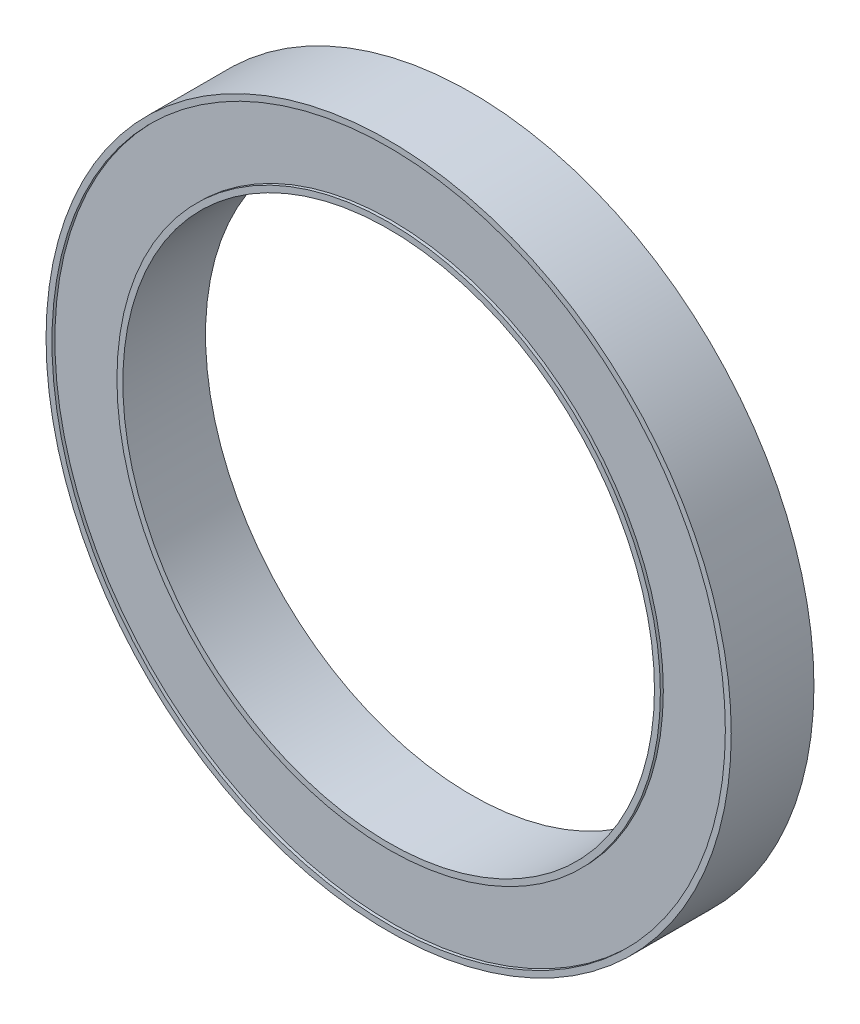
ISO-10303-21;
HEADER;
FILE_DESCRIPTION(('STEP AP214'),'2;1');
FILE_NAME('part.step','',(''),(''),'','','');
FILE_SCHEMA(('AUTOMOTIVE_DESIGN { 1 0 10303 214 1 1 1 1 }'));
ENDSEC;
DATA;
#1=APPLICATION_CONTEXT('core data for automotive mechanical design processes');
#2=APPLICATION_PROTOCOL_DEFINITION('international standard','automotive_design',2000,#1);
#3=PRODUCT_CONTEXT('',#1,'mechanical');
#4=PRODUCT('Part','Part','',(#3));
#5=PRODUCT_RELATED_PRODUCT_CATEGORY('part','',(#4));
#6=PRODUCT_DEFINITION_FORMATION('','',#4);
#7=PRODUCT_DEFINITION_CONTEXT('part definition',#1,'design');
#8=PRODUCT_DEFINITION('design','',#6,#7);
#9=PRODUCT_DEFINITION_SHAPE('','',#8);
#10=(LENGTH_UNIT() NAMED_UNIT(*) SI_UNIT(.MILLI.,.METRE.));
#11=(NAMED_UNIT(*) PLANE_ANGLE_UNIT() SI_UNIT($,.RADIAN.));
#12=(NAMED_UNIT(*) SI_UNIT($,.STERADIAN.) SOLID_ANGLE_UNIT());
#13=UNCERTAINTY_MEASURE_WITH_UNIT(LENGTH_MEASURE(1.E-05),#10,'distance_accuracy_value','');
#14=(GEOMETRIC_REPRESENTATION_CONTEXT(3) GLOBAL_UNCERTAINTY_ASSIGNED_CONTEXT((#13)) GLOBAL_UNIT_ASSIGNED_CONTEXT((#10,
#11,#12)) REPRESENTATION_CONTEXT('',''));
#15=CARTESIAN_POINT('',(0.,0.,0.));
#16=DIRECTION('',(0.,0.,1.));
#17=DIRECTION('',(1.,0.,0.));
#18=AXIS2_PLACEMENT_3D('',#15,#16,#17);
#19=CARTESIAN_POINT('',(0.,0.,-3.5));
#20=DIRECTION('',(0.,0.,1.));
#21=DIRECTION('',(1.,0.,0.));
#22=AXIS2_PLACEMENT_3D('',#19,#20,#21);
#23=PLANE('',#22);
#24=CARTESIAN_POINT('',(0.,0.,-3.5));
#25=DIRECTION('',(0.,0.,1.));
#26=DIRECTION('',(1.,0.,0.));
#27=AXIS2_PLACEMENT_3D('',#24,#25,#26);
#28=CIRCLE('',#27,22.5);
#29=CARTESIAN_POINT('',(22.5,0.,-3.5));
#30=VERTEX_POINT('',#29);
#31=EDGE_CURVE('E60',#30,#30,#28,.T.);
#32=ORIENTED_EDGE('',*,*,#31,.T.);
#33=EDGE_LOOP('',(#32));
#34=FACE_BOUND('',#33,.T.);
#35=CARTESIAN_POINT('',(0.,0.,-3.5));
#36=DIRECTION('',(0.,0.,1.));
#37=DIRECTION('',(1.,0.,0.));
#38=AXIS2_PLACEMENT_3D('',#35,#36,#37);
#39=CIRCLE('',#38,23.);
#40=CARTESIAN_POINT('',(23.,0.,-3.5));
#41=VERTEX_POINT('',#40);
#42=EDGE_CURVE('E84',#41,#41,#39,.T.);
#43=ORIENTED_EDGE('',*,*,#42,.F.);
#44=EDGE_LOOP('',(#43));
#45=FACE_BOUND('',#44,.T.);
#46=ADVANCED_FACE('F47',(#34,#45),#23,.F.);
#47=CARTESIAN_POINT('',(0.,0.,3.5));
#48=DIRECTION('',(0.,0.,1.));
#49=DIRECTION('',(1.,0.,0.));
#50=AXIS2_PLACEMENT_3D('',#47,#48,#49);
#51=PLANE('',#50);
#52=CARTESIAN_POINT('',(0.,0.,3.5));
#53=DIRECTION('',(0.,0.,1.));
#54=DIRECTION('',(1.,0.,0.));
#55=AXIS2_PLACEMENT_3D('',#52,#53,#54);
#56=CIRCLE('',#55,22.5);
#57=CARTESIAN_POINT('',(22.5,0.,3.5));
#58=VERTEX_POINT('',#57);
#59=EDGE_CURVE('E58',#58,#58,#56,.T.);
#60=ORIENTED_EDGE('',*,*,#59,.F.);
#61=EDGE_LOOP('',(#60));
#62=FACE_BOUND('',#61,.T.);
#63=CARTESIAN_POINT('',(0.,0.,3.5));
#64=DIRECTION('',(0.,0.,1.));
#65=DIRECTION('',(1.,0.,0.));
#66=AXIS2_PLACEMENT_3D('',#63,#64,#65);
#67=CIRCLE('',#66,23.);
#68=CARTESIAN_POINT('',(23.,0.,3.5));
#69=VERTEX_POINT('',#68);
#70=EDGE_CURVE('E72',#69,#69,#67,.T.);
#71=ORIENTED_EDGE('',*,*,#70,.T.);
#72=EDGE_LOOP('',(#71));
#73=FACE_BOUND('',#72,.T.);
#74=ADVANCED_FACE('F100',(#62,#73),#51,.T.);
#75=CARTESIAN_POINT('',(0.,0.,3.5));
#76=DIRECTION('',(0.,0.,1.));
#77=DIRECTION('',(1.,0.,0.));
#78=AXIS2_PLACEMENT_3D('',#75,#76,#77);
#79=CIRCLE('',#78,28.5);
#80=CARTESIAN_POINT('',(28.5,0.,3.5));
#81=VERTEX_POINT('',#80);
#82=EDGE_CURVE('E66',#81,#81,#79,.T.);
#83=ORIENTED_EDGE('',*,*,#82,.F.);
#84=EDGE_LOOP('',(#83));
#85=FACE_BOUND('',#84,.T.);
#86=CARTESIAN_POINT('',(0.,0.,3.5));
#87=DIRECTION('',(0.,0.,1.));
#88=DIRECTION('',(1.,0.,0.));
#89=AXIS2_PLACEMENT_3D('',#86,#87,#88);
#90=CIRCLE('',#89,29.);
#91=CARTESIAN_POINT('',(29.,0.,3.5));
#92=VERTEX_POINT('',#91);
#93=EDGE_CURVE('E11',#92,#92,#90,.T.);
#94=ORIENTED_EDGE('',*,*,#93,.T.);
#95=EDGE_LOOP('',(#94));
#96=FACE_BOUND('',#95,.T.);
#97=ADVANCED_FACE('F106',(#85,#96),#51,.T.);
#98=CARTESIAN_POINT('',(0.,0.,-3.5));
#99=DIRECTION('',(0.,0.,1.));
#100=DIRECTION('',(1.,0.,0.));
#101=AXIS2_PLACEMENT_3D('',#98,#99,#100);
#102=CIRCLE('',#101,28.5);
#103=CARTESIAN_POINT('',(28.5,0.,-3.5));
#104=VERTEX_POINT('',#103);
#105=EDGE_CURVE('E78',#104,#104,#102,.T.);
#106=ORIENTED_EDGE('',*,*,#105,.T.);
#107=EDGE_LOOP('',(#106));
#108=FACE_BOUND('',#107,.T.);
#109=CARTESIAN_POINT('',(0.,0.,-3.5));
#110=DIRECTION('',(0.,0.,1.));
#111=DIRECTION('',(1.,0.,0.));
#112=AXIS2_PLACEMENT_3D('',#109,#110,#111);
#113=CIRCLE('',#112,29.);
#114=CARTESIAN_POINT('',(29.,0.,-3.5));
#115=VERTEX_POINT('',#114);
#116=EDGE_CURVE('E51',#115,#115,#113,.T.);
#117=ORIENTED_EDGE('',*,*,#116,.F.);
#118=EDGE_LOOP('',(#117));
#119=FACE_BOUND('',#118,.T.);
#120=ADVANCED_FACE('F102',(#108,#119),#23,.F.);
#121=CARTESIAN_POINT('',(0.,0.,3.5));
#122=DIRECTION('',(0.,0.,-1.));
#123=DIRECTION('',(-1.,0.,0.));
#124=AXIS2_PLACEMENT_3D('',#121,#122,#123);
#125=CYLINDRICAL_SURFACE('',#124,29.);
#126=ORIENTED_EDGE('',*,*,#93,.F.);
#127=EDGE_LOOP('',(#126));
#128=FACE_BOUND('',#127,.T.);
#129=ORIENTED_EDGE('',*,*,#116,.T.);
#130=EDGE_LOOP('',(#129));
#131=FACE_BOUND('',#130,.T.);
#132=ADVANCED_FACE('F49',(#128,#131),#125,.T.);
#133=CARTESIAN_POINT('',(0.,0.,3.5));
#134=DIRECTION('',(0.,0.,-1.));
#135=DIRECTION('',(-1.,0.,0.));
#136=AXIS2_PLACEMENT_3D('',#133,#134,#135);
#137=CYLINDRICAL_SURFACE('',#136,22.5);
#138=ORIENTED_EDGE('',*,*,#59,.T.);
#139=EDGE_LOOP('',(#138));
#140=FACE_BOUND('',#139,.T.);
#141=ORIENTED_EDGE('',*,*,#31,.F.);
#142=EDGE_LOOP('',(#141));
#143=FACE_BOUND('',#142,.T.);
#144=ADVANCED_FACE('F115',(#140,#143),#137,.F.);
#145=CARTESIAN_POINT('',(0.,0.,3.25));
#146=DIRECTION('',(0.,0.,1.));
#147=DIRECTION('',(1.,0.,0.));
#148=AXIS2_PLACEMENT_3D('',#145,#146,#147);
#149=CYLINDRICAL_SURFACE('',#148,28.5);
#150=CARTESIAN_POINT('',(0.,0.,3.25));
#151=DIRECTION('',(0.,0.,1.));
#152=DIRECTION('',(1.,0.,0.));
#153=AXIS2_PLACEMENT_3D('',#150,#151,#152);
#154=CIRCLE('',#153,28.5);
#155=CARTESIAN_POINT('',(28.5,0.,3.25));
#156=VERTEX_POINT('',#155);
#157=EDGE_CURVE('E63',#156,#156,#154,.T.);
#158=ORIENTED_EDGE('',*,*,#157,.F.);
#159=EDGE_LOOP('',(#158));
#160=FACE_BOUND('',#159,.T.);
#161=ORIENTED_EDGE('',*,*,#82,.T.);
#162=EDGE_LOOP('',(#161));
#163=FACE_BOUND('',#162,.T.);
#164=ADVANCED_FACE('F139',(#160,#163),#149,.F.);
#165=CARTESIAN_POINT('',(0.,0.,3.25));
#166=DIRECTION('',(0.,0.,1.));
#167=DIRECTION('',(1.,0.,0.));
#168=AXIS2_PLACEMENT_3D('',#165,#166,#167);
#169=PLANE('',#168);
#170=CARTESIAN_POINT('',(0.,0.,3.25));
#171=DIRECTION('',(0.,0.,1.));
#172=DIRECTION('',(1.,0.,0.));
#173=AXIS2_PLACEMENT_3D('',#170,#171,#172);
#174=CIRCLE('',#173,23.);
#175=CARTESIAN_POINT('',(23.,0.,3.25));
#176=VERTEX_POINT('',#175);
#177=EDGE_CURVE('E69',#176,#176,#174,.T.);
#178=ORIENTED_EDGE('',*,*,#177,.F.);
#179=EDGE_LOOP('',(#178));
#180=FACE_BOUND('',#179,.T.);
#181=ORIENTED_EDGE('',*,*,#157,.T.);
#182=EDGE_LOOP('',(#181));
#183=FACE_BOUND('',#182,.T.);
#184=ADVANCED_FACE('F135',(#180,#183),#169,.T.);
#185=CARTESIAN_POINT('',(0.,0.,3.25));
#186=DIRECTION('',(0.,0.,1.));
#187=DIRECTION('',(1.,0.,0.));
#188=AXIS2_PLACEMENT_3D('',#185,#186,#187);
#189=CYLINDRICAL_SURFACE('',#188,23.);
#190=ORIENTED_EDGE('',*,*,#177,.T.);
#191=EDGE_LOOP('',(#190));
#192=FACE_BOUND('',#191,.T.);
#193=ORIENTED_EDGE('',*,*,#70,.F.);
#194=EDGE_LOOP('',(#193));
#195=FACE_BOUND('',#194,.T.);
#196=ADVANCED_FACE('F129',(#192,#195),#189,.T.);
#197=CARTESIAN_POINT('',(0.,0.,-3.25));
#198=DIRECTION('',(0.,0.,-1.));
#199=DIRECTION('',(1.,0.,0.));
#200=AXIS2_PLACEMENT_3D('',#197,#198,#199);
#201=PLANE('',#200);
#202=CARTESIAN_POINT('',(0.,0.,-3.25));
#203=DIRECTION('',(0.,0.,1.));
#204=DIRECTION('',(1.,0.,0.));
#205=AXIS2_PLACEMENT_3D('',#202,#203,#204);
#206=CIRCLE('',#205,28.5);
#207=CARTESIAN_POINT('',(28.5,0.,-3.25));
#208=VERTEX_POINT('',#207);
#209=EDGE_CURVE('E75',#208,#208,#206,.T.);
#210=ORIENTED_EDGE('',*,*,#209,.F.);
#211=EDGE_LOOP('',(#210));
#212=FACE_BOUND('',#211,.T.);
#213=CARTESIAN_POINT('',(0.,0.,-3.25));
#214=DIRECTION('',(0.,0.,1.));
#215=DIRECTION('',(1.,0.,0.));
#216=AXIS2_PLACEMENT_3D('',#213,#214,#215);
#217=CIRCLE('',#216,23.);
#218=CARTESIAN_POINT('',(23.,0.,-3.25));
#219=VERTEX_POINT('',#218);
#220=EDGE_CURVE('E81',#219,#219,#217,.T.);
#221=ORIENTED_EDGE('',*,*,#220,.T.);
#222=EDGE_LOOP('',(#221));
#223=FACE_BOUND('',#222,.T.);
#224=ADVANCED_FACE('F90',(#212,#223),#201,.T.);
#225=CARTESIAN_POINT('',(0.,0.,-3.25));
#226=DIRECTION('',(0.,0.,-1.));
#227=DIRECTION('',(-1.,0.,0.));
#228=AXIS2_PLACEMENT_3D('',#225,#226,#227);
#229=CYLINDRICAL_SURFACE('',#228,28.5);
#230=ORIENTED_EDGE('',*,*,#209,.T.);
#231=EDGE_LOOP('',(#230));
#232=FACE_BOUND('',#231,.T.);
#233=ORIENTED_EDGE('',*,*,#105,.F.);
#234=EDGE_LOOP('',(#233));
#235=FACE_BOUND('',#234,.T.);
#236=ADVANCED_FACE('F95',(#232,#235),#229,.F.);
#237=CARTESIAN_POINT('',(0.,0.,-3.25));
#238=DIRECTION('',(0.,0.,-1.));
#239=DIRECTION('',(-1.,0.,0.));
#240=AXIS2_PLACEMENT_3D('',#237,#238,#239);
#241=CYLINDRICAL_SURFACE('',#240,23.);
#242=ORIENTED_EDGE('',*,*,#220,.F.);
#243=EDGE_LOOP('',(#242));
#244=FACE_BOUND('',#243,.T.);
#245=ORIENTED_EDGE('',*,*,#42,.T.);
#246=EDGE_LOOP('',(#245));
#247=FACE_BOUND('',#246,.T.);
#248=ADVANCED_FACE('F92',(#244,#247),#241,.T.);
#249=CLOSED_SHELL('',(#46,#74,#97,#120,#132,#144,#164,#184,#196,#224,#236,#248));
#250=MANIFOLD_SOLID_BREP('B2',#249);
#251=ADVANCED_BREP_SHAPE_REPRESENTATION('',(#18,#250),#14);
#252=SHAPE_DEFINITION_REPRESENTATION(#9,#251);
ENDSEC;
END-ISO-10303-21;
